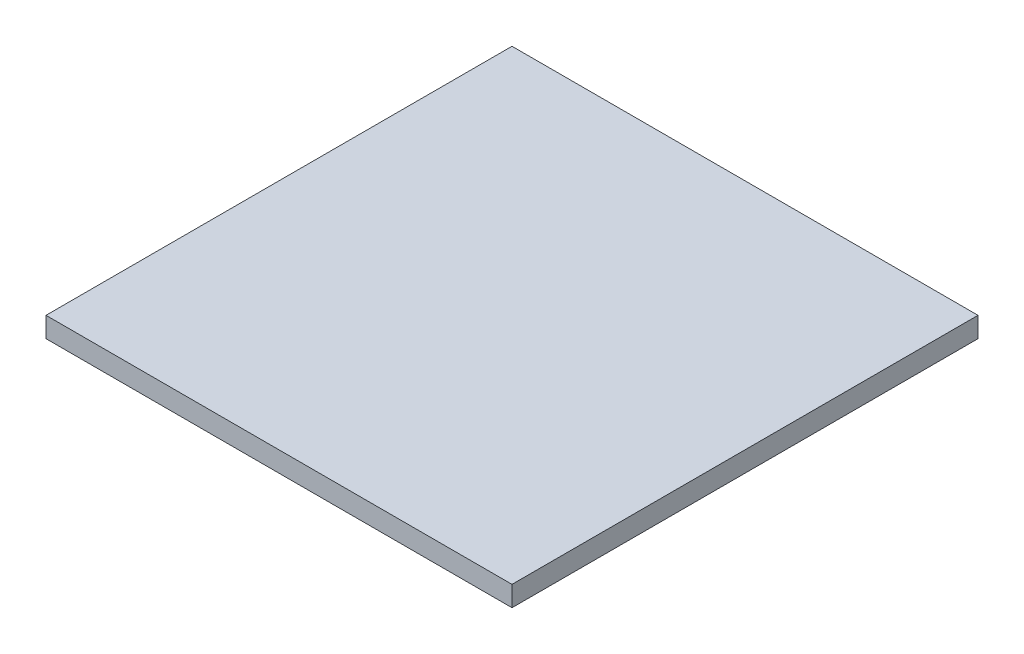
ISO-10303-21;
HEADER;
FILE_DESCRIPTION(('STEP AP214'),'2;1');
FILE_NAME('part.step','',(''),(''),'','','');
FILE_SCHEMA(('AUTOMOTIVE_DESIGN { 1 0 10303 214 1 1 1 1 }'));
ENDSEC;
DATA;
#1=APPLICATION_CONTEXT('core data for automotive mechanical design processes');
#2=APPLICATION_PROTOCOL_DEFINITION('international standard','automotive_design',2000,#1);
#3=PRODUCT_CONTEXT('',#1,'mechanical');
#4=PRODUCT('Part','Part','',(#3));
#5=PRODUCT_RELATED_PRODUCT_CATEGORY('part','',(#4));
#6=PRODUCT_DEFINITION_FORMATION('','',#4);
#7=PRODUCT_DEFINITION_CONTEXT('part definition',#1,'design');
#8=PRODUCT_DEFINITION('design','',#6,#7);
#9=PRODUCT_DEFINITION_SHAPE('','',#8);
#10=(LENGTH_UNIT() NAMED_UNIT(*) SI_UNIT(.MILLI.,.METRE.));
#11=(NAMED_UNIT(*) PLANE_ANGLE_UNIT() SI_UNIT($,.RADIAN.));
#12=(NAMED_UNIT(*) SI_UNIT($,.STERADIAN.) SOLID_ANGLE_UNIT());
#13=UNCERTAINTY_MEASURE_WITH_UNIT(LENGTH_MEASURE(1.E-05),#10,'distance_accuracy_value','');
#14=(GEOMETRIC_REPRESENTATION_CONTEXT(3) GLOBAL_UNCERTAINTY_ASSIGNED_CONTEXT((#13)) GLOBAL_UNIT_ASSIGNED_CONTEXT((#10,
#11,#12)) REPRESENTATION_CONTEXT('',''));
#15=CARTESIAN_POINT('',(0.,0.,0.));
#16=DIRECTION('',(0.,0.,1.));
#17=DIRECTION('',(1.,0.,0.));
#18=AXIS2_PLACEMENT_3D('',#15,#16,#17);
#19=CARTESIAN_POINT('',(146.05,12.7,146.05));
#20=DIRECTION('',(-1.,0.,0.));
#21=DIRECTION('',(0.,0.,1.));
#22=AXIS2_PLACEMENT_3D('',#19,#20,#21);
#23=PLANE('',#22);
#24=DIRECTION('',(0.,0.,-1.));
#25=VECTOR('',#24,1.);
#26=CARTESIAN_POINT('',(146.05,0.,146.05));
#27=LINE('',#26,#25);
#28=CARTESIAN_POINT('',(146.05,0.,146.05));
#29=VERTEX_POINT('',#28);
#30=CARTESIAN_POINT('',(146.05,0.,-146.05));
#31=VERTEX_POINT('',#30);
#32=EDGE_CURVE('E96',#29,#31,#27,.T.);
#33=ORIENTED_EDGE('',*,*,#32,.T.);
#34=DIRECTION('',(0.,-1.,0.));
#35=VECTOR('',#34,1.);
#36=CARTESIAN_POINT('',(146.05,12.7,-146.05));
#37=LINE('',#36,#35);
#38=CARTESIAN_POINT('',(146.05,12.7,-146.05));
#39=VERTEX_POINT('',#38);
#40=EDGE_CURVE('E11',#39,#31,#37,.T.);
#41=ORIENTED_EDGE('',*,*,#40,.F.);
#42=DIRECTION('',(0.,0.,-1.));
#43=VECTOR('',#42,1.);
#44=CARTESIAN_POINT('',(146.05,12.7,146.05));
#45=LINE('',#44,#43);
#46=CARTESIAN_POINT('',(146.05,12.7,146.05));
#47=VERTEX_POINT('',#46);
#48=EDGE_CURVE('E84',#47,#39,#45,.T.);
#49=ORIENTED_EDGE('',*,*,#48,.F.);
#50=DIRECTION('',(0.,-1.,0.));
#51=VECTOR('',#50,1.);
#52=CARTESIAN_POINT('',(146.05,12.7,146.05));
#53=LINE('',#52,#51);
#54=EDGE_CURVE('E92',#47,#29,#53,.T.);
#55=ORIENTED_EDGE('',*,*,#54,.T.);
#56=EDGE_LOOP('',(#33,#41,#49,#55));
#57=FACE_BOUND('',#56,.T.);
#58=ADVANCED_FACE('F33',(#57),#23,.F.);
#59=CARTESIAN_POINT('',(-146.05,12.7,-146.05));
#60=DIRECTION('',(0.,0.,1.));
#61=DIRECTION('',(1.,0.,0.));
#62=AXIS2_PLACEMENT_3D('',#59,#60,#61);
#63=PLANE('',#62);
#64=DIRECTION('',(-1.,0.,0.));
#65=VECTOR('',#64,1.);
#66=CARTESIAN_POINT('',(-146.05,0.,-146.05));
#67=LINE('',#66,#65);
#68=CARTESIAN_POINT('',(-146.05,0.,-146.05));
#69=VERTEX_POINT('',#68);
#70=EDGE_CURVE('E88',#31,#69,#67,.T.);
#71=ORIENTED_EDGE('',*,*,#70,.T.);
#72=DIRECTION('',(0.,-1.,0.));
#73=VECTOR('',#72,1.);
#74=CARTESIAN_POINT('',(-146.05,12.7,-146.05));
#75=LINE('',#74,#73);
#76=CARTESIAN_POINT('',(-146.05,12.7,-146.05));
#77=VERTEX_POINT('',#76);
#78=EDGE_CURVE('E41',#77,#69,#75,.T.);
#79=ORIENTED_EDGE('',*,*,#78,.F.);
#80=DIRECTION('',(-1.,0.,0.));
#81=VECTOR('',#80,1.);
#82=CARTESIAN_POINT('',(-146.05,12.7,-146.05));
#83=LINE('',#82,#81);
#84=EDGE_CURVE('E79',#39,#77,#83,.T.);
#85=ORIENTED_EDGE('',*,*,#84,.F.);
#86=ORIENTED_EDGE('',*,*,#40,.T.);
#87=EDGE_LOOP('',(#71,#79,#85,#86));
#88=FACE_BOUND('',#87,.T.);
#89=ADVANCED_FACE('F87',(#88),#63,.F.);
#90=CARTESIAN_POINT('',(-146.05,12.7,146.05));
#91=DIRECTION('',(1.,0.,0.));
#92=DIRECTION('',(0.,0.,-1.));
#93=AXIS2_PLACEMENT_3D('',#90,#91,#92);
#94=PLANE('',#93);
#95=DIRECTION('',(0.,0.,1.));
#96=VECTOR('',#95,1.);
#97=CARTESIAN_POINT('',(-146.05,0.,146.05));
#98=LINE('',#97,#96);
#99=CARTESIAN_POINT('',(-146.05,0.,146.05));
#100=VERTEX_POINT('',#99);
#101=EDGE_CURVE('E66',#69,#100,#98,.T.);
#102=ORIENTED_EDGE('',*,*,#101,.T.);
#103=DIRECTION('',(0.,-1.,0.));
#104=VECTOR('',#103,1.);
#105=CARTESIAN_POINT('',(-146.05,12.7,146.05));
#106=LINE('',#105,#104);
#107=CARTESIAN_POINT('',(-146.05,12.7,146.05));
#108=VERTEX_POINT('',#107);
#109=EDGE_CURVE('E89',#108,#100,#106,.T.);
#110=ORIENTED_EDGE('',*,*,#109,.F.);
#111=DIRECTION('',(0.,0.,1.));
#112=VECTOR('',#111,1.);
#113=CARTESIAN_POINT('',(-146.05,12.7,146.05));
#114=LINE('',#113,#112);
#115=EDGE_CURVE('E82',#77,#108,#114,.T.);
#116=ORIENTED_EDGE('',*,*,#115,.F.);
#117=ORIENTED_EDGE('',*,*,#78,.T.);
#118=EDGE_LOOP('',(#102,#110,#116,#117));
#119=FACE_BOUND('',#118,.T.);
#120=ADVANCED_FACE('F90',(#119),#94,.F.);
#121=CARTESIAN_POINT('',(-146.05,12.7,146.05));
#122=DIRECTION('',(0.,0.,-1.));
#123=DIRECTION('',(-1.,0.,0.));
#124=AXIS2_PLACEMENT_3D('',#121,#122,#123);
#125=PLANE('',#124);
#126=DIRECTION('',(1.,0.,0.));
#127=VECTOR('',#126,1.);
#128=CARTESIAN_POINT('',(-146.05,0.,146.05));
#129=LINE('',#128,#127);
#130=EDGE_CURVE('E72',#100,#29,#129,.T.);
#131=ORIENTED_EDGE('',*,*,#130,.T.);
#132=ORIENTED_EDGE('',*,*,#54,.F.);
#133=DIRECTION('',(1.,0.,0.));
#134=VECTOR('',#133,1.);
#135=CARTESIAN_POINT('',(-146.05,12.7,146.05));
#136=LINE('',#135,#134);
#137=EDGE_CURVE('E49',#108,#47,#136,.T.);
#138=ORIENTED_EDGE('',*,*,#137,.F.);
#139=ORIENTED_EDGE('',*,*,#109,.T.);
#140=EDGE_LOOP('',(#131,#132,#138,#139));
#141=FACE_BOUND('',#140,.T.);
#142=ADVANCED_FACE('F103',(#141),#125,.F.);
#143=CARTESIAN_POINT('',(0.,12.7,0.));
#144=DIRECTION('',(0.,-1.,0.));
#145=DIRECTION('',(0.,0.,-1.));
#146=AXIS2_PLACEMENT_3D('',#143,#144,#145);
#147=PLANE('',#146);
#148=ORIENTED_EDGE('',*,*,#48,.T.);
#149=ORIENTED_EDGE('',*,*,#84,.T.);
#150=ORIENTED_EDGE('',*,*,#115,.T.);
#151=ORIENTED_EDGE('',*,*,#137,.T.);
#152=EDGE_LOOP('',(#148,#149,#150,#151));
#153=FACE_BOUND('',#152,.T.);
#154=ADVANCED_FACE('F80',(#153),#147,.F.);
#155=CARTESIAN_POINT('',(0.,0.,0.));
#156=DIRECTION('',(0.,-1.,0.));
#157=DIRECTION('',(0.,0.,-1.));
#158=AXIS2_PLACEMENT_3D('',#155,#156,#157);
#159=PLANE('',#158);
#160=ORIENTED_EDGE('',*,*,#32,.F.);
#161=ORIENTED_EDGE('',*,*,#130,.F.);
#162=ORIENTED_EDGE('',*,*,#101,.F.);
#163=ORIENTED_EDGE('',*,*,#70,.F.);
#164=EDGE_LOOP('',(#160,#161,#162,#163));
#165=FACE_BOUND('',#164,.T.);
#166=ADVANCED_FACE('F106',(#165),#159,.T.);
#167=CLOSED_SHELL('',(#58,#89,#120,#142,#154,#166));
#168=MANIFOLD_SOLID_BREP('B2',#167);
#169=ADVANCED_BREP_SHAPE_REPRESENTATION('',(#18,#168),#14);
#170=SHAPE_DEFINITION_REPRESENTATION(#9,#169);
ENDSEC;
END-ISO-10303-21;
